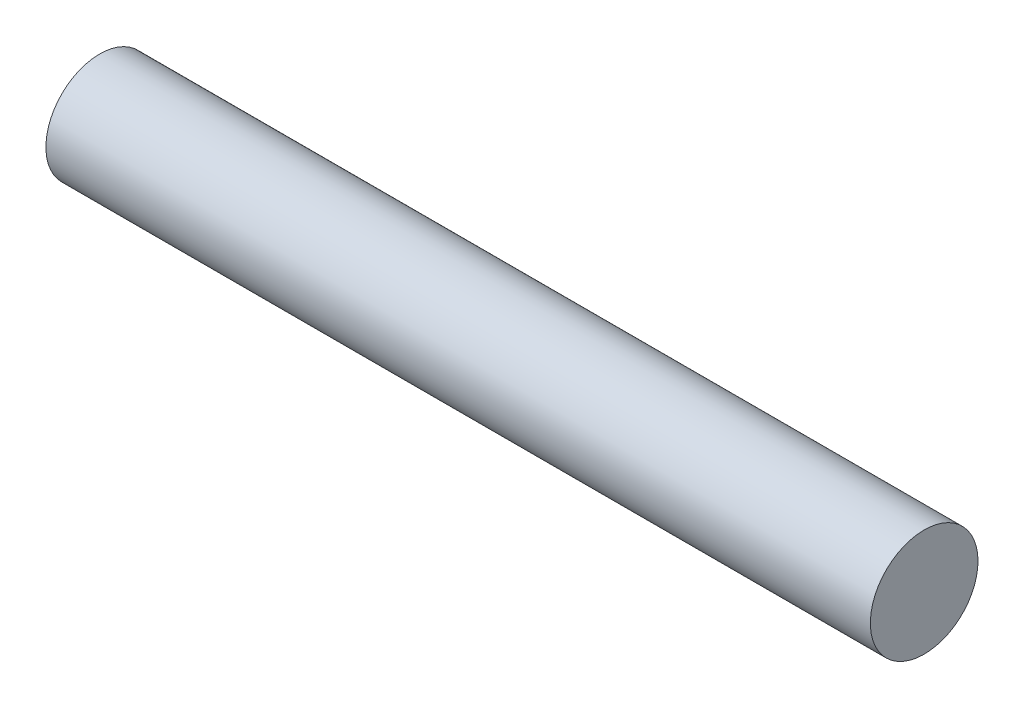
ISO-10303-21;
HEADER;
FILE_DESCRIPTION(('STEP AP214'),'2;1');
FILE_NAME('part.step','',(''),(''),'','','');
FILE_SCHEMA(('AUTOMOTIVE_DESIGN { 1 0 10303 214 1 1 1 1 }'));
ENDSEC;
DATA;
#1=APPLICATION_CONTEXT('core data for automotive mechanical design processes');
#2=APPLICATION_PROTOCOL_DEFINITION('international standard','automotive_design',2000,#1);
#3=PRODUCT_CONTEXT('',#1,'mechanical');
#4=PRODUCT('Part','Part','',(#3));
#5=PRODUCT_RELATED_PRODUCT_CATEGORY('part','',(#4));
#6=PRODUCT_DEFINITION_FORMATION('','',#4);
#7=PRODUCT_DEFINITION_CONTEXT('part definition',#1,'design');
#8=PRODUCT_DEFINITION('design','',#6,#7);
#9=PRODUCT_DEFINITION_SHAPE('','',#8);
#10=(LENGTH_UNIT() NAMED_UNIT(*) SI_UNIT(.MILLI.,.METRE.));
#11=(NAMED_UNIT(*) PLANE_ANGLE_UNIT() SI_UNIT($,.RADIAN.));
#12=(NAMED_UNIT(*) SI_UNIT($,.STERADIAN.) SOLID_ANGLE_UNIT());
#13=UNCERTAINTY_MEASURE_WITH_UNIT(LENGTH_MEASURE(1.E-05),#10,'distance_accuracy_value','');
#14=(GEOMETRIC_REPRESENTATION_CONTEXT(3) GLOBAL_UNCERTAINTY_ASSIGNED_CONTEXT((#13)) GLOBAL_UNIT_ASSIGNED_CONTEXT((#10,
#11,#12)) REPRESENTATION_CONTEXT('',''));
#15=CARTESIAN_POINT('',(0.,0.,0.));
#16=DIRECTION('',(0.,0.,1.));
#17=DIRECTION('',(1.,0.,0.));
#18=AXIS2_PLACEMENT_3D('',#15,#16,#17);
#19=CARTESIAN_POINT('',(751.,0.,0.));
#20=DIRECTION('',(-1.,0.,0.));
#21=DIRECTION('',(0.,0.,1.));
#22=AXIS2_PLACEMENT_3D('',#19,#20,#21);
#23=CYLINDRICAL_SURFACE('',#22,49.022);
#24=CARTESIAN_POINT('',(751.,0.,0.));
#25=DIRECTION('',(1.,0.,0.));
#26=DIRECTION('',(0.,0.,-1.));
#27=AXIS2_PLACEMENT_3D('',#24,#25,#26);
#28=CIRCLE('',#27,49.022);
#29=CARTESIAN_POINT('',(751.,0.,-49.022));
#30=VERTEX_POINT('',#29);
#31=EDGE_CURVE('E10',#30,#30,#28,.T.);
#32=ORIENTED_EDGE('',*,*,#31,.F.);
#33=EDGE_LOOP('',(#32));
#34=FACE_BOUND('',#33,.T.);
#35=CARTESIAN_POINT('',(0.,0.,0.));
#36=DIRECTION('',(1.,0.,0.));
#37=DIRECTION('',(0.,0.,-1.));
#38=AXIS2_PLACEMENT_3D('',#35,#36,#37);
#39=CIRCLE('',#38,49.022);
#40=CARTESIAN_POINT('',(0.,0.,-49.022));
#41=VERTEX_POINT('',#40);
#42=EDGE_CURVE('E40',#41,#41,#39,.T.);
#43=ORIENTED_EDGE('',*,*,#42,.T.);
#44=EDGE_LOOP('',(#43));
#45=FACE_BOUND('',#44,.T.);
#46=ADVANCED_FACE('F37',(#34,#45),#23,.T.);
#47=CARTESIAN_POINT('',(751.,0.,0.));
#48=DIRECTION('',(1.,0.,0.));
#49=DIRECTION('',(0.,0.,-1.));
#50=AXIS2_PLACEMENT_3D('',#47,#48,#49);
#51=PLANE('',#50);
#52=ORIENTED_EDGE('',*,*,#31,.T.);
#53=EDGE_LOOP('',(#52));
#54=FACE_BOUND('',#53,.T.);
#55=ADVANCED_FACE('F52',(#54),#51,.T.);
#56=CARTESIAN_POINT('',(0.,0.,0.));
#57=DIRECTION('',(1.,0.,0.));
#58=DIRECTION('',(0.,0.,-1.));
#59=AXIS2_PLACEMENT_3D('',#56,#57,#58);
#60=PLANE('',#59);
#61=ORIENTED_EDGE('',*,*,#42,.F.);
#62=EDGE_LOOP('',(#61));
#63=FACE_BOUND('',#62,.T.);
#64=ADVANCED_FACE('F50',(#63),#60,.F.);
#65=CLOSED_SHELL('',(#46,#55,#64));
#66=MANIFOLD_SOLID_BREP('B2',#65);
#67=ADVANCED_BREP_SHAPE_REPRESENTATION('',(#18,#66),#14);
#68=SHAPE_DEFINITION_REPRESENTATION(#9,#67);
ENDSEC;
END-ISO-10303-21;
